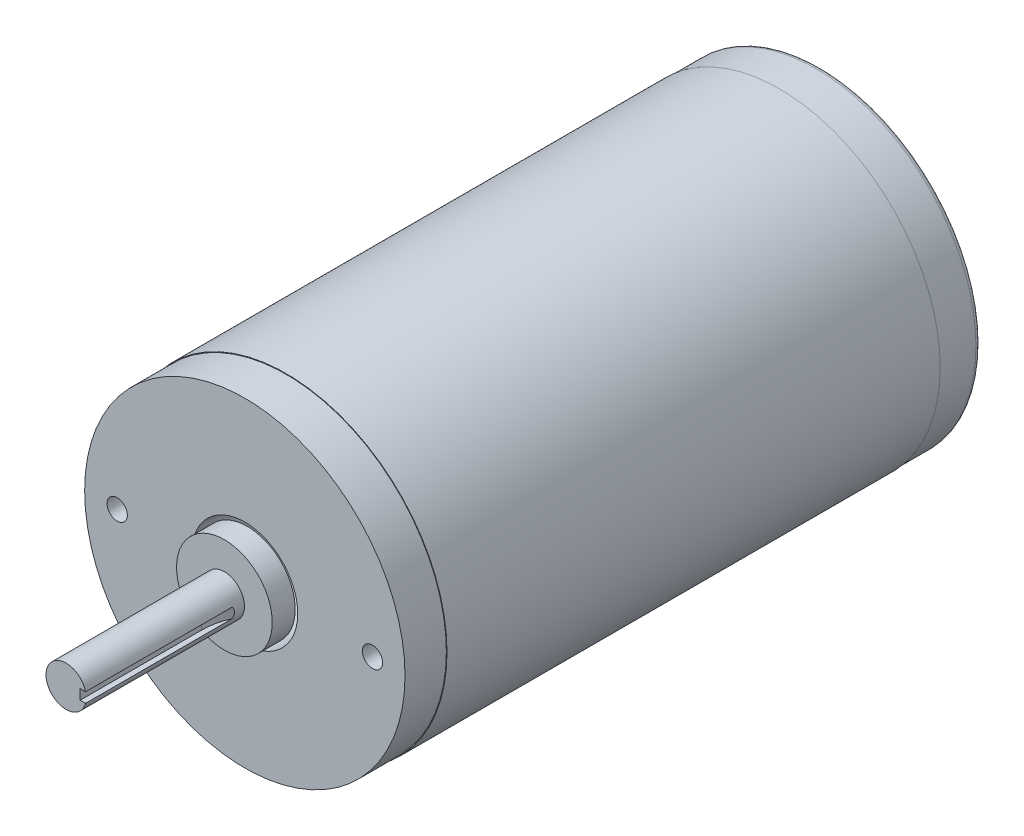
ISO-10303-21;
HEADER;
FILE_DESCRIPTION(('STEP AP214'),'2;1');
FILE_NAME('part.step','',(''),(''),'','','');
FILE_SCHEMA(('AUTOMOTIVE_DESIGN { 1 0 10303 214 1 1 1 1 }'));
ENDSEC;
DATA;
#1=APPLICATION_CONTEXT('core data for automotive mechanical design processes');
#2=APPLICATION_PROTOCOL_DEFINITION('international standard','automotive_design',2000,#1);
#3=PRODUCT_CONTEXT('',#1,'mechanical');
#4=PRODUCT('Part','Part','',(#3));
#5=PRODUCT_RELATED_PRODUCT_CATEGORY('part','',(#4));
#6=PRODUCT_DEFINITION_FORMATION('','',#4);
#7=PRODUCT_DEFINITION_CONTEXT('part definition',#1,'design');
#8=PRODUCT_DEFINITION('design','',#6,#7);
#9=PRODUCT_DEFINITION_SHAPE('','',#8);
#10=(LENGTH_UNIT() NAMED_UNIT(*) SI_UNIT(.MILLI.,.METRE.));
#11=(NAMED_UNIT(*) PLANE_ANGLE_UNIT() SI_UNIT($,.RADIAN.));
#12=(NAMED_UNIT(*) SI_UNIT($,.STERADIAN.) SOLID_ANGLE_UNIT());
#13=UNCERTAINTY_MEASURE_WITH_UNIT(LENGTH_MEASURE(1.E-05),#10,'distance_accuracy_value','');
#14=(GEOMETRIC_REPRESENTATION_CONTEXT(3) GLOBAL_UNCERTAINTY_ASSIGNED_CONTEXT((#13)) GLOBAL_UNIT_ASSIGNED_CONTEXT((#10,
#11,#12)) REPRESENTATION_CONTEXT('',''));
#15=CARTESIAN_POINT('',(0.,0.,0.));
#16=DIRECTION('',(0.,0.,1.));
#17=DIRECTION('',(1.,0.,0.));
#18=AXIS2_PLACEMENT_3D('',#15,#16,#17);
#19=CARTESIAN_POINT('',(35.56,109.2962,18.542));
#20=DIRECTION('',(0.,0.,1.));
#21=DIRECTION('',(1.,0.,0.));
#22=AXIS2_PLACEMENT_3D('',#19,#20,#21);
#23=PLANE('',#22);
#24=CARTESIAN_POINT('',(35.56,109.2962,18.542));
#25=DIRECTION('',(0.,0.,-1.));
#26=DIRECTION('',(-1.,0.,0.));
#27=AXIS2_PLACEMENT_3D('',#24,#25,#26);
#28=CIRCLE('',#27,9.52500000000019);
#29=CARTESIAN_POINT('',(26.0349999999998,109.2962,18.542));
#30=VERTEX_POINT('',#29);
#31=EDGE_CURVE('P0_E19',#30,#30,#28,.F.);
#32=ORIENTED_EDGE('',*,*,#31,.F.);
#33=EDGE_LOOP('',(#32));
#34=FACE_BOUND('',#33,.T.);
#35=ADVANCED_FACE('P0_F16',(#34),#23,.F.);
#36=CARTESIAN_POINT('',(35.56,109.2962,23.114));
#37=DIRECTION('',(0.,0.,-1.));
#38=DIRECTION('',(-1.,0.,0.));
#39=AXIS2_PLACEMENT_3D('',#36,#37,#38);
#40=CYLINDRICAL_SURFACE('',#39,9.52500000000019);
#41=CARTESIAN_POINT('',(35.56,109.2962,23.114));
#42=DIRECTION('',(0.,0.,-1.));
#43=DIRECTION('',(-1.,0.,0.));
#44=AXIS2_PLACEMENT_3D('',#41,#42,#43);
#45=CIRCLE('',#44,9.52500000000019);
#46=CARTESIAN_POINT('',(26.0349999999998,109.2962,23.114));
#47=VERTEX_POINT('',#46);
#48=EDGE_CURVE('P0_E73',#47,#47,#45,.F.);
#49=ORIENTED_EDGE('',*,*,#48,.F.);
#50=EDGE_LOOP('',(#49));
#51=FACE_BOUND('',#50,.T.);
#52=ORIENTED_EDGE('',*,*,#31,.T.);
#53=EDGE_LOOP('',(#52));
#54=FACE_BOUND('',#53,.T.);
#55=ADVANCED_FACE('P0_F126',(#51,#54),#40,.T.);
#56=CARTESIAN_POINT('',(38.36,108.2962,-87.326199999998));
#57=DIRECTION('',(0.,-1.,0.));
#58=DIRECTION('',(1.,0.,0.));
#59=AXIS2_PLACEMENT_3D('',#56,#57,#58);
#60=PLANE('',#59);
#61=DIRECTION('',(1.,0.,0.));
#62=VECTOR('',#61,1.);
#63=CARTESIAN_POINT('',(38.36,108.2962,54.614));
#64=LINE('',#63,#62);
#65=CARTESIAN_POINT('',(39.4329833462075,108.2962,54.614));
#66=VERTEX_POINT('',#65);
#67=CARTESIAN_POINT('',(38.36,108.2962,54.614));
#68=VERTEX_POINT('',#67);
#69=EDGE_CURVE('P0_E64',#66,#68,#64,.F.);
#70=ORIENTED_EDGE('',*,*,#69,.F.);
#71=DIRECTION('',(0.,0.,-1.));
#72=VECTOR('',#71,1.);
#73=CARTESIAN_POINT('',(39.4329833462075,108.2962,54.614));
#74=LINE('',#73,#72);
#75=CARTESIAN_POINT('',(39.4329833462075,108.2962,25.3938184471467));
#76=VERTEX_POINT('',#75);
#77=EDGE_CURVE('P0_E61',#76,#66,#74,.F.);
#78=ORIENTED_EDGE('',*,*,#77,.F.);
#79=CARTESIAN_POINT('',(51.0600000000007,108.2962,30.5028774341242));
#80=DIRECTION('',(0.,1.,0.));
#81=DIRECTION('',(0.,0.,1.));
#82=AXIS2_PLACEMENT_3D('',#79,#80,#81);
#83=CIRCLE('',#82,12.7);
#84=CARTESIAN_POINT('',(38.36,108.2962,30.5028774341242));
#85=VERTEX_POINT('',#84);
#86=EDGE_CURVE('P0_E53',#76,#85,#83,.T.);
#87=ORIENTED_EDGE('',*,*,#86,.T.);
#88=DIRECTION('',(0.,0.,1.));
#89=VECTOR('',#88,1.);
#90=CARTESIAN_POINT('',(38.36,108.2962,-87.326199999998));
#91=LINE('',#90,#89);
#92=EDGE_CURVE('P0_E58',#85,#68,#91,.T.);
#93=ORIENTED_EDGE('',*,*,#92,.T.);
#94=EDGE_LOOP('',(#70,#78,#87,#93));
#95=FACE_BOUND('',#94,.T.);
#96=ADVANCED_FACE('P0_F56',(#95),#60,.F.);
#97=CARTESIAN_POINT('',(51.0600000000007,110.2962,30.5028774341242));
#98=DIRECTION('',(0.,1.,0.));
#99=DIRECTION('',(0.,0.,1.));
#100=AXIS2_PLACEMENT_3D('',#97,#98,#99);
#101=CYLINDRICAL_SURFACE('',#100,12.7);
#102=DIRECTION('',(0.,1.,0.));
#103=VECTOR('',#102,1.);
#104=CARTESIAN_POINT('',(38.36,110.2962,30.5028774341242));
#105=LINE('',#104,#103);
#106=CARTESIAN_POINT('',(38.36,110.2962,30.5028774341242));
#107=VERTEX_POINT('',#106);
#108=EDGE_CURVE('P0_E66',#107,#85,#105,.F.);
#109=ORIENTED_EDGE('',*,*,#108,.T.);
#110=ORIENTED_EDGE('',*,*,#86,.F.);
#111=CARTESIAN_POINT('',(39.4329833462075,110.2962,25.3938184471467));
#112=CARTESIAN_POINT('',(39.4443337341014,110.252233067405,25.3679868799096));
#113=CARTESIAN_POINT('',(39.4551422770259,110.20727992269,25.343623419365));
#114=CARTESIAN_POINT('',(39.4754908545726,110.115440889332,25.2980943853887));
#115=CARTESIAN_POINT('',(39.4850293802644,110.068552786821,25.2769326119428));
#116=CARTESIAN_POINT('',(39.5114158870653,109.925246069415,25.2187466684963));
#117=CARTESIAN_POINT('',(39.5260449336521,109.826146942811,25.1869990834614));
#118=CARTESIAN_POINT('',(39.5445173704809,109.65480942391,25.1471349749067));
#119=CARTESIAN_POINT('',(39.5502970689254,109.583739791249,25.1347469712102));
#120=CARTESIAN_POINT('',(39.5580378376477,109.44052295343,25.1181817732074));
#121=CARTESIAN_POINT('',(39.5600037215014,109.36837722257,25.1139942286931));
#122=CARTESIAN_POINT('',(39.5599946275477,109.192003156294,25.1140083316092));
#123=CARTESIAN_POINT('',(39.5558844928082,109.087740682188,25.1227557563576));
#124=CARTESIAN_POINT('',(39.5398789538826,108.882407215092,25.1571177496053));
#125=CARTESIAN_POINT('',(39.527961125063,108.781346296514,25.1827809034122));
#126=CARTESIAN_POINT('',(39.5022370611798,108.615369663549,25.2389677686343));
#127=CARTESIAN_POINT('',(39.4901145703297,108.548828415953,25.2656236567621));
#128=CARTESIAN_POINT('',(39.4633247699613,108.419617122596,25.3252155966219));
#129=CARTESIAN_POINT('',(39.4486722045253,108.356927353284,25.3581153663461));
#130=CARTESIAN_POINT('',(39.4329833462075,108.2962,25.3938184471467));
#131=B_SPLINE_CURVE_WITH_KNOTS('',3,(#111,#112,#113,#114,#115,#116,#117,#118,#119,#120,#121,
#122,#123,#124,#125,#126,#127,#128,#129,#130),.UNSPECIFIED.,.F.,.F.,(4,2,2,2,2,2,2,2,2,4),(0.,
0.156654458532963,0.313493411076015,0.627036132035703,0.843633608325465,1.05995752950285,
1.37224815252889,1.68543966723697,1.90313772112854,2.11960749579829),.UNSPECIFIED.);
#132=CARTESIAN_POINT('',(39.4329833462075,110.2962,25.3938184471467));
#133=VERTEX_POINT('',#132);
#134=EDGE_CURVE('P0_E93',#133,#76,#131,.T.);
#135=ORIENTED_EDGE('',*,*,#134,.F.);
#136=CARTESIAN_POINT('',(51.0600000000007,110.2962,30.5028774341242));
#137=DIRECTION('',(0.,1.,0.));
#138=DIRECTION('',(0.,0.,1.));
#139=AXIS2_PLACEMENT_3D('',#136,#137,#138);
#140=CIRCLE('',#139,12.7);
#141=EDGE_CURVE('P0_E69',#133,#107,#140,.T.);
#142=ORIENTED_EDGE('',*,*,#141,.T.);
#143=EDGE_LOOP('',(#109,#110,#135,#142));
#144=FACE_BOUND('',#143,.T.);
#145=ADVANCED_FACE('P0_F67',(#144),#101,.F.);
#146=CARTESIAN_POINT('',(38.36,110.2962,-87.326199999998));
#147=DIRECTION('',(-1.,0.,0.));
#148=DIRECTION('',(0.,0.,1.));
#149=AXIS2_PLACEMENT_3D('',#146,#147,#148);
#150=PLANE('',#149);
#151=DIRECTION('',(0.,0.,1.));
#152=VECTOR('',#151,1.);
#153=CARTESIAN_POINT('',(38.36,110.2962,-87.326199999998));
#154=LINE('',#153,#152);
#155=CARTESIAN_POINT('',(38.36,110.2962,54.614));
#156=VERTEX_POINT('',#155);
#157=EDGE_CURVE('P0_E92',#107,#156,#154,.T.);
#158=ORIENTED_EDGE('',*,*,#157,.T.);
#159=DIRECTION('',(0.,1.,0.));
#160=VECTOR('',#159,1.);
#161=CARTESIAN_POINT('',(38.36,109.2962,54.614));
#162=LINE('',#161,#160);
#163=EDGE_CURVE('P0_E76',#68,#156,#162,.T.);
#164=ORIENTED_EDGE('',*,*,#163,.F.);
#165=ORIENTED_EDGE('',*,*,#92,.F.);
#166=ORIENTED_EDGE('',*,*,#108,.F.);
#167=EDGE_LOOP('',(#158,#164,#165,#166));
#168=FACE_BOUND('',#167,.T.);
#169=ADVANCED_FACE('P0_F75',(#168),#150,.F.);
#170=CARTESIAN_POINT('',(35.56,109.2962,23.114));
#171=DIRECTION('',(0.,0.,1.));
#172=DIRECTION('',(1.,0.,0.));
#173=AXIS2_PLACEMENT_3D('',#170,#171,#172);
#174=PLANE('',#173);
#175=CARTESIAN_POINT('',(35.56,109.2962,23.114));
#176=DIRECTION('',(0.,0.,-1.));
#177=DIRECTION('',(-1.,0.,0.));
#178=AXIS2_PLACEMENT_3D('',#175,#176,#177);
#179=CIRCLE('',#178,4.00000000000007);
#180=CARTESIAN_POINT('',(31.5599999999999,109.2962,23.114));
#181=VERTEX_POINT('',#180);
#182=EDGE_CURVE('P0_E88',#181,#181,#179,.F.);
#183=ORIENTED_EDGE('',*,*,#182,.F.);
#184=EDGE_LOOP('',(#183));
#185=FACE_BOUND('',#184,.T.);
#186=ORIENTED_EDGE('',*,*,#48,.T.);
#187=EDGE_LOOP('',(#186));
#188=FACE_BOUND('',#187,.T.);
#189=ADVANCED_FACE('P0_F115',(#185,#188),#174,.T.);
#190=CARTESIAN_POINT('',(35.56,109.2962,54.614));
#191=DIRECTION('',(0.,0.,1.));
#192=DIRECTION('',(1.,0.,0.));
#193=AXIS2_PLACEMENT_3D('',#190,#191,#192);
#194=PLANE('',#193);
#195=ORIENTED_EDGE('',*,*,#69,.T.);
#196=ORIENTED_EDGE('',*,*,#163,.T.);
#197=DIRECTION('',(-1.,0.,0.));
#198=VECTOR('',#197,1.);
#199=CARTESIAN_POINT('',(39.4329833462075,110.2962,54.614));
#200=LINE('',#199,#198);
#201=CARTESIAN_POINT('',(39.4329833462075,110.2962,54.614));
#202=VERTEX_POINT('',#201);
#203=EDGE_CURVE('P0_E33',#156,#202,#200,.F.);
#204=ORIENTED_EDGE('',*,*,#203,.T.);
#205=CARTESIAN_POINT('',(35.56,109.2962,54.614));
#206=DIRECTION('',(0.,0.,-1.));
#207=DIRECTION('',(-1.,0.,0.));
#208=AXIS2_PLACEMENT_3D('',#205,#206,#207);
#209=CIRCLE('',#208,4.00000000000007);
#210=EDGE_CURVE('P0_E25',#66,#202,#209,.T.);
#211=ORIENTED_EDGE('',*,*,#210,.F.);
#212=EDGE_LOOP('',(#195,#196,#204,#211));
#213=FACE_BOUND('',#212,.T.);
#214=ADVANCED_FACE('P0_F111',(#213),#194,.T.);
#215=CARTESIAN_POINT('',(39.4329833462075,110.2962,-87.326199999998));
#216=DIRECTION('',(0.,1.,0.));
#217=DIRECTION('',(-1.,0.,0.));
#218=AXIS2_PLACEMENT_3D('',#215,#216,#217);
#219=PLANE('',#218);
#220=ORIENTED_EDGE('',*,*,#203,.F.);
#221=ORIENTED_EDGE('',*,*,#157,.F.);
#222=ORIENTED_EDGE('',*,*,#141,.F.);
#223=DIRECTION('',(0.,0.,-1.));
#224=VECTOR('',#223,1.);
#225=CARTESIAN_POINT('',(39.4329833462075,110.2962,54.614));
#226=LINE('',#225,#224);
#227=EDGE_CURVE('P0_E11',#202,#133,#226,.T.);
#228=ORIENTED_EDGE('',*,*,#227,.F.);
#229=EDGE_LOOP('',(#220,#221,#222,#228));
#230=FACE_BOUND('',#229,.T.);
#231=ADVANCED_FACE('P0_F107',(#230),#219,.F.);
#232=CARTESIAN_POINT('',(35.56,109.2962,54.614));
#233=DIRECTION('',(0.,0.,-1.));
#234=DIRECTION('',(-1.,0.,0.));
#235=AXIS2_PLACEMENT_3D('',#232,#233,#234);
#236=CYLINDRICAL_SURFACE('',#235,4.00000000000007);
#237=ORIENTED_EDGE('',*,*,#182,.T.);
#238=EDGE_LOOP('',(#237));
#239=FACE_BOUND('',#238,.T.);
#240=ORIENTED_EDGE('',*,*,#210,.T.);
#241=ORIENTED_EDGE('',*,*,#227,.T.);
#242=ORIENTED_EDGE('',*,*,#134,.T.);
#243=ORIENTED_EDGE('',*,*,#77,.T.);
#244=EDGE_LOOP('',(#240,#241,#242,#243));
#245=FACE_BOUND('',#244,.T.);
#246=ADVANCED_FACE('P0_F103',(#239,#245),#236,.T.);
#247=CLOSED_SHELL('',(#35,#55,#96,#145,#169,#189,#214,#231,#246));
#248=MANIFOLD_SOLID_BREP('P0_B1',#247);
#249=CARTESIAN_POINT('',(54.1670906828555,120.503559639096,-97.8026999999982));
#250=DIRECTION('',(0.,0.,-1.));
#251=DIRECTION('',(-1.,0.,0.));
#252=AXIS2_PLACEMENT_3D('',#249,#250,#251);
#253=PLANE('',#252);
#254=CARTESIAN_POINT('',(54.1670906828555,120.503559639096,-97.8026999999884));
#255=DIRECTION('',(0.,0.,1.));
#256=DIRECTION('',(1.,0.,0.));
#257=AXIS2_PLACEMENT_3D('',#254,#255,#256);
#258=CIRCLE('',#257,2.11800000002163);
#259=CARTESIAN_POINT('',(56.2850906828771,120.503559639096,-97.8026999999884));
#260=VERTEX_POINT('',#259);
#261=EDGE_CURVE('P1_E216',#260,#260,#258,.T.);
#262=ORIENTED_EDGE('',*,*,#261,.F.);
#263=EDGE_LOOP('',(#262));
#264=FACE_BOUND('',#263,.T.);
#265=ADVANCED_FACE('P1_F16',(#264),#253,.T.);
#266=CARTESIAN_POINT('',(46.7673596390944,127.903290682857,-97.802699999998));
#267=DIRECTION('',(0.,0.,-1.));
#268=DIRECTION('',(-1.,0.,0.));
#269=AXIS2_PLACEMENT_3D('',#266,#267,#268);
#270=PLANE('',#269);
#271=CARTESIAN_POINT('',(46.7673596390944,127.903290682857,-97.8027000000452));
#272=DIRECTION('',(0.,0.,1.));
#273=DIRECTION('',(1.,0.,0.));
#274=AXIS2_PLACEMENT_3D('',#271,#272,#273);
#275=CIRCLE('',#274,2.11799999993556);
#276=CARTESIAN_POINT('',(48.88535963903,127.903290682857,-97.8027000000452));
#277=VERTEX_POINT('',#276);
#278=EDGE_CURVE('P1_E57',#277,#277,#275,.T.);
#279=ORIENTED_EDGE('',*,*,#278,.F.);
#280=EDGE_LOOP('',(#279));
#281=FACE_BOUND('',#280,.T.);
#282=ADVANCED_FACE('P1_F105',(#281),#270,.T.);
#283=CARTESIAN_POINT('',(35.56,109.2962,-100.317299999998));
#284=DIRECTION('',(0.,0.,-1.));
#285=DIRECTION('',(-1.,0.,0.));
#286=AXIS2_PLACEMENT_3D('',#283,#284,#285);
#287=PLANE('',#286);
#288=CARTESIAN_POINT('',(35.56,109.2962,-100.317299999998));
#289=DIRECTION('',(0.,0.,1.));
#290=DIRECTION('',(1.,0.,0.));
#291=AXIS2_PLACEMENT_3D('',#288,#289,#290);
#292=CIRCLE('',#291,14.0368000000003);
#293=CARTESIAN_POINT('',(49.5968000000003,109.2962,-100.317299999998));
#294=VERTEX_POINT('',#293);
#295=CARTESIAN_POINT('',(21.5231999999997,109.2962,-100.317299999998));
#296=VERTEX_POINT('',#295);
#297=EDGE_CURVE('P1_E55',#294,#296,#292,.T.);
#298=ORIENTED_EDGE('',*,*,#297,.F.);
#299=CARTESIAN_POINT('',(35.56,109.2962,-100.317299999998));
#300=DIRECTION('',(0.,0.,1.));
#301=DIRECTION('',(-1.,0.,0.));
#302=AXIS2_PLACEMENT_3D('',#299,#300,#301);
#303=CIRCLE('',#302,14.0368000000003);
#304=EDGE_CURVE('P1_E50',#296,#294,#303,.T.);
#305=ORIENTED_EDGE('',*,*,#304,.F.);
#306=EDGE_LOOP('',(#298,#305));
#307=FACE_BOUND('',#306,.T.);
#308=ADVANCED_FACE('P1_F54',(#307),#287,.T.);
#309=CARTESIAN_POINT('',(54.1670906828555,120.503559639096,-95.6026999980963));
#310=DIRECTION('',(0.,0.,1.));
#311=DIRECTION('',(1.,0.,0.));
#312=AXIS2_PLACEMENT_3D('',#309,#310,#311);
#313=CONICAL_SURFACE('',#312,4.31800000191365,0.785398163397448);
#314=ORIENTED_EDGE('',*,*,#261,.T.);
#315=EDGE_LOOP('',(#314));
#316=FACE_BOUND('',#315,.T.);
#317=CARTESIAN_POINT('',(54.1670906828555,120.503559639096,-95.6026999980706));
#318=DIRECTION('',(0.,0.,-1.));
#319=DIRECTION('',(-1.,0.,0.));
#320=AXIS2_PLACEMENT_3D('',#317,#318,#319);
#321=CIRCLE('',#320,4.31800000195455);
#322=CARTESIAN_POINT('',(49.8490906809009,120.503559639096,-95.6026999980706));
#323=VERTEX_POINT('',#322);
#324=EDGE_CURVE('P1_E63',#323,#323,#321,.F.);
#325=ORIENTED_EDGE('',*,*,#324,.F.);
#326=EDGE_LOOP('',(#325));
#327=FACE_BOUND('',#326,.T.);
#328=ADVANCED_FACE('P1_F104',(#316,#327),#313,.T.);
#329=CARTESIAN_POINT('',(46.7673596390944,127.903290682857,-95.6026999980963));
#330=DIRECTION('',(0.,0.,1.));
#331=DIRECTION('',(1.,0.,0.));
#332=AXIS2_PLACEMENT_3D('',#329,#330,#331);
#333=CONICAL_SURFACE('',#332,4.31800000188443,0.785398163397448);
#334=ORIENTED_EDGE('',*,*,#278,.T.);
#335=EDGE_LOOP('',(#334));
#336=FACE_BOUND('',#335,.T.);
#337=CARTESIAN_POINT('',(46.7673596390944,127.903290682857,-95.6026999980564));
#338=DIRECTION('',(0.,0.,-1.));
#339=DIRECTION('',(-1.,0.,0.));
#340=AXIS2_PLACEMENT_3D('',#337,#338,#339);
#341=CIRCLE('',#340,4.31800000194089);
#342=CARTESIAN_POINT('',(42.4493596371535,127.903290682857,-95.6026999980564));
#343=VERTEX_POINT('',#342);
#344=EDGE_CURVE('P1_E91',#343,#343,#341,.F.);
#345=ORIENTED_EDGE('',*,*,#344,.F.);
#346=EDGE_LOOP('',(#345));
#347=FACE_BOUND('',#346,.T.);
#348=ADVANCED_FACE('P1_F82',(#336,#347),#333,.T.);
#349=CARTESIAN_POINT('',(35.56,109.2962,-99.317299999998));
#350=DIRECTION('',(0.,0.,-1.));
#351=DIRECTION('',(-1.,0.,0.));
#352=AXIS2_PLACEMENT_3D('',#349,#350,#351);
#353=TOROIDAL_SURFACE('',#352,14.0368000000003,0.999999999999999);
#354=ORIENTED_EDGE('',*,*,#304,.T.);
#355=ORIENTED_EDGE('',*,*,#297,.T.);
#356=EDGE_LOOP('',(#354,#355));
#357=FACE_BOUND('',#356,.T.);
#358=CARTESIAN_POINT('',(35.56,109.2962,-99.317299999998));
#359=DIRECTION('',(0.,0.,1.));
#360=DIRECTION('',(1.,0.,0.));
#361=AXIS2_PLACEMENT_3D('',#358,#359,#360);
#362=CIRCLE('',#361,15.0368000000003);
#363=CARTESIAN_POINT('',(50.5968000000003,109.2962,-99.317299999998));
#364=VERTEX_POINT('',#363);
#365=EDGE_CURVE('P1_E89',#364,#364,#362,.T.);
#366=ORIENTED_EDGE('',*,*,#365,.F.);
#367=EDGE_LOOP('',(#366));
#368=FACE_BOUND('',#367,.T.);
#369=ADVANCED_FACE('P1_F61',(#357,#368),#353,.T.);
#370=CARTESIAN_POINT('',(54.1670906828555,120.503559639096,-95.554799999998));
#371=DIRECTION('',(0.,0.,-1.));
#372=DIRECTION('',(-1.,0.,0.));
#373=AXIS2_PLACEMENT_3D('',#370,#371,#372);
#374=CYLINDRICAL_SURFACE('',#373,4.31800000195455);
#375=CARTESIAN_POINT('',(54.1670906828555,120.503559639096,-95.554799999998));
#376=DIRECTION('',(0.,0.,-1.));
#377=DIRECTION('',(-1.,0.,0.));
#378=AXIS2_PLACEMENT_3D('',#375,#376,#377);
#379=CIRCLE('',#378,4.31800000195455);
#380=CARTESIAN_POINT('',(49.8490906809009,120.503559639096,-95.554799999998));
#381=VERTEX_POINT('',#380);
#382=EDGE_CURVE('P1_E207',#381,#381,#379,.F.);
#383=ORIENTED_EDGE('',*,*,#382,.F.);
#384=EDGE_LOOP('',(#383));
#385=FACE_BOUND('',#384,.T.);
#386=ORIENTED_EDGE('',*,*,#324,.T.);
#387=EDGE_LOOP('',(#386));
#388=FACE_BOUND('',#387,.T.);
#389=ADVANCED_FACE('P1_F81',(#385,#388),#374,.T.);
#390=CARTESIAN_POINT('',(46.7673596390944,127.903290682857,-95.554799999998));
#391=DIRECTION('',(0.,0.,-1.));
#392=DIRECTION('',(-1.,0.,0.));
#393=AXIS2_PLACEMENT_3D('',#390,#391,#392);
#394=CYLINDRICAL_SURFACE('',#393,4.31800000194089);
#395=CARTESIAN_POINT('',(46.7673596390944,127.903290682857,-95.554799999998));
#396=DIRECTION('',(0.,0.,-1.));
#397=DIRECTION('',(-1.,0.,0.));
#398=AXIS2_PLACEMENT_3D('',#395,#396,#397);
#399=CIRCLE('',#398,4.31800000194089);
#400=CARTESIAN_POINT('',(42.4493596371535,127.903290682857,-95.554799999998));
#401=VERTEX_POINT('',#400);
#402=EDGE_CURVE('P1_E203',#401,#401,#399,.F.);
#403=ORIENTED_EDGE('',*,*,#402,.F.);
#404=EDGE_LOOP('',(#403));
#405=FACE_BOUND('',#404,.T.);
#406=ORIENTED_EDGE('',*,*,#344,.T.);
#407=EDGE_LOOP('',(#406));
#408=FACE_BOUND('',#407,.T.);
#409=ADVANCED_FACE('P1_F362',(#405,#408),#394,.T.);
#410=CARTESIAN_POINT('',(35.56,109.2962,-100.317299999998));
#411=DIRECTION('',(0.,0.,1.));
#412=DIRECTION('',(1.,0.,0.));
#413=AXIS2_PLACEMENT_3D('',#410,#411,#412);
#414=CYLINDRICAL_SURFACE('',#413,15.0368000000003);
#415=CARTESIAN_POINT('',(35.56,109.2962,-95.554799999998));
#416=DIRECTION('',(0.,0.,1.));
#417=DIRECTION('',(1.,0.,0.));
#418=AXIS2_PLACEMENT_3D('',#415,#416,#417);
#419=CIRCLE('',#418,15.0368000000003);
#420=CARTESIAN_POINT('',(50.5968000000003,109.2962,-95.554799999998));
#421=VERTEX_POINT('',#420);
#422=EDGE_CURVE('P1_E199',#421,#421,#419,.T.);
#423=ORIENTED_EDGE('',*,*,#422,.F.);
#424=EDGE_LOOP('',(#423));
#425=FACE_BOUND('',#424,.T.);
#426=ORIENTED_EDGE('',*,*,#365,.T.);
#427=EDGE_LOOP('',(#426));
#428=FACE_BOUND('',#427,.T.);
#429=ADVANCED_FACE('P1_F353',(#425,#428),#414,.T.);
#430=CARTESIAN_POINT('',(60.96,109.2962,5.43559999999843));
#431=DIRECTION('',(0.,0.,1.));
#432=DIRECTION('',(1.,0.,0.));
#433=AXIS2_PLACEMENT_3D('',#430,#431,#432);
#434=CONICAL_SURFACE('',#433,2.01930000005181,1.0297442573607);
#435=CARTESIAN_POINT('',(60.9599999998807,109.2962,4.22228214836196));
#436=VERTEX_POINT('',#435);
#437=VERTEX_LOOP('',#436);
#438=FACE_BOUND('',#437,.T.);
#439=CARTESIAN_POINT('',(60.96,109.2962,5.43560000000074));
#440=DIRECTION('',(0.,0.,1.));
#441=DIRECTION('',(1.,0.,0.));
#442=AXIS2_PLACEMENT_3D('',#439,#440,#441);
#443=CIRCLE('',#442,2.01930000000004);
#444=CARTESIAN_POINT('',(62.9793,109.2962,5.43560000000074));
#445=VERTEX_POINT('',#444);
#446=EDGE_CURVE('P1_E197',#445,#445,#443,.T.);
#447=ORIENTED_EDGE('',*,*,#446,.T.);
#448=EDGE_LOOP('',(#447));
#449=FACE_BOUND('',#448,.T.);
#450=ADVANCED_FACE('P1_F345',(#438,#449),#434,.F.);
#451=CARTESIAN_POINT('',(10.1599999999994,109.2962,5.43559999994159));
#452=DIRECTION('',(0.,0.,1.));
#453=DIRECTION('',(1.,0.,0.));
#454=AXIS2_PLACEMENT_3D('',#451,#452,#453);
#455=CONICAL_SURFACE('',#454,2.01929999984395,1.02974425732522);
#456=CARTESIAN_POINT('',(10.1600000001131,109.2962,4.22228214870302));
#457=VERTEX_POINT('',#456);
#458=VERTEX_LOOP('',#457);
#459=FACE_BOUND('',#458,.T.);
#460=CARTESIAN_POINT('',(10.1599999999994,109.2962,5.4356000000007));
#461=DIRECTION('',(0.,0.,1.));
#462=DIRECTION('',(1.,0.,0.));
#463=AXIS2_PLACEMENT_3D('',#460,#461,#462);
#464=CIRCLE('',#463,2.01930000000004);
#465=CARTESIAN_POINT('',(12.1792999999994,109.2962,5.4356000000007));
#466=VERTEX_POINT('',#465);
#467=EDGE_CURVE('P1_E189',#466,#466,#464,.T.);
#468=ORIENTED_EDGE('',*,*,#467,.T.);
#469=EDGE_LOOP('',(#468));
#470=FACE_BOUND('',#469,.T.);
#471=ADVANCED_FACE('P1_F338',(#459,#470),#455,.F.);
#472=CARTESIAN_POINT('',(35.56,109.2962,-87.325199999998));
#473=DIRECTION('',(0.,0.,-1.));
#474=DIRECTION('',(-1.,0.,0.));
#475=AXIS2_PLACEMENT_3D('',#472,#473,#474);
#476=PLANE('',#475);
#477=CARTESIAN_POINT('',(35.56,109.2962,-87.325199999998));
#478=DIRECTION('',(0.,0.,1.));
#479=DIRECTION('',(1.,0.,0.));
#480=AXIS2_PLACEMENT_3D('',#477,#478,#479);
#481=CIRCLE('',#480,10.5283000000002);
#482=CARTESIAN_POINT('',(46.0883000000002,109.2962,-87.325199999998));
#483=VERTEX_POINT('',#482);
#484=EDGE_CURVE('P1_E196',#483,#483,#481,.T.);
#485=ORIENTED_EDGE('',*,*,#484,.T.);
#486=EDGE_LOOP('',(#485));
#487=FACE_BOUND('',#486,.T.);
#488=ADVANCED_FACE('P1_F174',(#487),#476,.F.);
#489=CARTESIAN_POINT('',(35.56,109.2962,-95.554799999998));
#490=DIRECTION('',(0.,0.,-1.));
#491=DIRECTION('',(-1.,0.,0.));
#492=AXIS2_PLACEMENT_3D('',#489,#490,#491);
#493=PLANE('',#492);
#494=ORIENTED_EDGE('',*,*,#422,.T.);
#495=EDGE_LOOP('',(#494));
#496=FACE_BOUND('',#495,.T.);
#497=ORIENTED_EDGE('',*,*,#402,.T.);
#498=EDGE_LOOP('',(#497));
#499=FACE_BOUND('',#498,.T.);
#500=ORIENTED_EDGE('',*,*,#382,.T.);
#501=EDGE_LOOP('',(#500));
#502=FACE_BOUND('',#501,.T.);
#503=CARTESIAN_POINT('',(35.56,109.2962,-95.554799999998));
#504=DIRECTION('',(0.,0.,1.));
#505=DIRECTION('',(1.,0.,0.));
#506=AXIS2_PLACEMENT_3D('',#503,#504,#505);
#507=CIRCLE('',#506,30.8770000000005);
#508=CARTESIAN_POINT('',(66.4370000000005,109.2962,-95.554799999998));
#509=VERTEX_POINT('',#508);
#510=CARTESIAN_POINT('',(4.6829999999995,109.2962,-95.554799999998));
#511=VERTEX_POINT('',#510);
#512=EDGE_CURVE('P1_E158',#509,#511,#507,.T.);
#513=ORIENTED_EDGE('',*,*,#512,.F.);
#514=CARTESIAN_POINT('',(35.56,109.2962,-95.554799999998));
#515=DIRECTION('',(0.,0.,1.));
#516=DIRECTION('',(-1.,0.,0.));
#517=AXIS2_PLACEMENT_3D('',#514,#515,#516);
#518=CIRCLE('',#517,30.8770000000005);
#519=EDGE_CURVE('P1_E35',#511,#509,#518,.T.);
#520=ORIENTED_EDGE('',*,*,#519,.F.);
#521=EDGE_LOOP('',(#513,#520));
#522=FACE_BOUND('',#521,.T.);
#523=ADVANCED_FACE('P1_F163',(#496,#499,#502,#522),#493,.T.);
#524=CARTESIAN_POINT('',(60.96,109.2962,19.05));
#525=DIRECTION('',(0.,0.,1.));
#526=DIRECTION('',(1.,0.,0.));
#527=AXIS2_PLACEMENT_3D('',#524,#525,#526);
#528=CYLINDRICAL_SURFACE('',#527,2.01930000000004);
#529=CARTESIAN_POINT('',(60.96,109.2962,19.05));
#530=DIRECTION('',(0.,0.,1.));
#531=DIRECTION('',(1.,0.,0.));
#532=AXIS2_PLACEMENT_3D('',#529,#530,#531);
#533=CIRCLE('',#532,2.01930000000004);
#534=CARTESIAN_POINT('',(62.9793,109.2962,19.05));
#535=VERTEX_POINT('',#534);
#536=EDGE_CURVE('P1_E228',#535,#535,#533,.F.);
#537=ORIENTED_EDGE('',*,*,#536,.F.);
#538=EDGE_LOOP('',(#537));
#539=FACE_BOUND('',#538,.T.);
#540=ORIENTED_EDGE('',*,*,#446,.F.);
#541=EDGE_LOOP('',(#540));
#542=FACE_BOUND('',#541,.T.);
#543=ADVANCED_FACE('P1_F173',(#539,#542),#528,.F.);
#544=CARTESIAN_POINT('',(10.1599999999994,109.2962,19.05));
#545=DIRECTION('',(0.,0.,1.));
#546=DIRECTION('',(1.,0.,0.));
#547=AXIS2_PLACEMENT_3D('',#544,#545,#546);
#548=CYLINDRICAL_SURFACE('',#547,2.01930000000004);
#549=CARTESIAN_POINT('',(10.1599999999994,109.2962,19.05));
#550=DIRECTION('',(0.,0.,1.));
#551=DIRECTION('',(1.,0.,0.));
#552=AXIS2_PLACEMENT_3D('',#549,#550,#551);
#553=CIRCLE('',#552,2.01930000000004);
#554=CARTESIAN_POINT('',(12.1792999999994,109.2962,19.05));
#555=VERTEX_POINT('',#554);
#556=EDGE_CURVE('P1_E244',#555,#555,#553,.F.);
#557=ORIENTED_EDGE('',*,*,#556,.F.);
#558=EDGE_LOOP('',(#557));
#559=FACE_BOUND('',#558,.T.);
#560=ORIENTED_EDGE('',*,*,#467,.F.);
#561=EDGE_LOOP('',(#560));
#562=FACE_BOUND('',#561,.T.);
#563=ADVANCED_FACE('P1_F234',(#559,#562),#548,.F.);
#564=CARTESIAN_POINT('',(35.56,109.2962,19.05));
#565=DIRECTION('',(0.,0.,1.));
#566=DIRECTION('',(1.,0.,0.));
#567=AXIS2_PLACEMENT_3D('',#564,#565,#566);
#568=CYLINDRICAL_SURFACE('',#567,10.5283000000002);
#569=CARTESIAN_POINT('',(35.56,109.2962,19.05));
#570=DIRECTION('',(0.,0.,1.));
#571=DIRECTION('',(1.,0.,0.));
#572=AXIS2_PLACEMENT_3D('',#569,#570,#571);
#573=CIRCLE('',#572,10.5283000000002);
#574=CARTESIAN_POINT('',(46.0883000000002,109.2962,19.05));
#575=VERTEX_POINT('',#574);
#576=EDGE_CURVE('P1_E242',#575,#575,#573,.F.);
#577=ORIENTED_EDGE('',*,*,#576,.F.);
#578=EDGE_LOOP('',(#577));
#579=FACE_BOUND('',#578,.T.);
#580=ORIENTED_EDGE('',*,*,#484,.F.);
#581=EDGE_LOOP('',(#580));
#582=FACE_BOUND('',#581,.T.);
#583=ADVANCED_FACE('P1_F148',(#579,#582),#568,.F.);
#584=CARTESIAN_POINT('',(35.56,109.2962,-94.554799999998));
#585=DIRECTION('',(0.,0.,-1.));
#586=DIRECTION('',(-1.,0.,0.));
#587=AXIS2_PLACEMENT_3D('',#584,#585,#586);
#588=TOROIDAL_SURFACE('',#587,30.8770000000005,0.999999999999999);
#589=ORIENTED_EDGE('',*,*,#519,.T.);
#590=ORIENTED_EDGE('',*,*,#512,.T.);
#591=EDGE_LOOP('',(#589,#590));
#592=FACE_BOUND('',#591,.T.);
#593=CARTESIAN_POINT('',(35.56,109.2962,-94.554799999998));
#594=DIRECTION('',(0.,0.,1.));
#595=DIRECTION('',(1.,0.,0.));
#596=AXIS2_PLACEMENT_3D('',#593,#594,#595);
#597=CIRCLE('',#596,31.8770000000005);
#598=CARTESIAN_POINT('',(67.4370000000005,109.2962,-94.554799999998));
#599=VERTEX_POINT('',#598);
#600=EDGE_CURVE('P1_E156',#599,#599,#597,.T.);
#601=ORIENTED_EDGE('',*,*,#600,.F.);
#602=EDGE_LOOP('',(#601));
#603=FACE_BOUND('',#602,.T.);
#604=ADVANCED_FACE('P1_F142',(#592,#603),#588,.T.);
#605=CARTESIAN_POINT('',(35.56,109.2962,19.05));
#606=DIRECTION('',(0.,0.,1.));
#607=DIRECTION('',(1.,0.,0.));
#608=AXIS2_PLACEMENT_3D('',#605,#606,#607);
#609=PLANE('',#608);
#610=CARTESIAN_POINT('',(35.56,109.2962,19.05));
#611=DIRECTION('',(0.,0.,-1.));
#612=DIRECTION('',(-1.,0.,0.));
#613=AXIS2_PLACEMENT_3D('',#610,#611,#612);
#614=CIRCLE('',#613,31.8770000000005);
#615=CARTESIAN_POINT('',(3.6829999999995,109.2962,19.05));
#616=VERTEX_POINT('',#615);
#617=EDGE_CURVE('P1_E247',#616,#616,#614,.T.);
#618=ORIENTED_EDGE('',*,*,#617,.F.);
#619=EDGE_LOOP('',(#618));
#620=FACE_BOUND('',#619,.T.);
#621=ORIENTED_EDGE('',*,*,#576,.T.);
#622=EDGE_LOOP('',(#621));
#623=FACE_BOUND('',#622,.T.);
#624=ORIENTED_EDGE('',*,*,#556,.T.);
#625=EDGE_LOOP('',(#624));
#626=FACE_BOUND('',#625,.T.);
#627=ORIENTED_EDGE('',*,*,#536,.T.);
#628=EDGE_LOOP('',(#627));
#629=FACE_BOUND('',#628,.T.);
#630=ADVANCED_FACE('P1_F138',(#620,#623,#626,#629),#609,.T.);
#631=CARTESIAN_POINT('',(35.56,109.2962,-95.554799999998));
#632=DIRECTION('',(0.,0.,1.));
#633=DIRECTION('',(1.,0.,0.));
#634=AXIS2_PLACEMENT_3D('',#631,#632,#633);
#635=CYLINDRICAL_SURFACE('',#634,31.8770000000005);
#636=CARTESIAN_POINT('',(35.56,109.2962,-87.325199999998));
#637=DIRECTION('',(0.,0.,1.));
#638=DIRECTION('',(1.,0.,0.));
#639=AXIS2_PLACEMENT_3D('',#636,#637,#638);
#640=CIRCLE('',#639,31.8770000000005);
#641=CARTESIAN_POINT('',(67.4370000000005,109.2962,-87.325199999998));
#642=VERTEX_POINT('',#641);
#643=EDGE_CURVE('P1_E441',#642,#642,#640,.T.);
#644=ORIENTED_EDGE('',*,*,#643,.F.);
#645=EDGE_LOOP('',(#644));
#646=FACE_BOUND('',#645,.T.);
#647=ORIENTED_EDGE('',*,*,#600,.T.);
#648=EDGE_LOOP('',(#647));
#649=FACE_BOUND('',#648,.T.);
#650=ADVANCED_FACE('P1_F134',(#646,#649),#635,.T.);
#651=CARTESIAN_POINT('',(35.56,109.2962,19.05));
#652=DIRECTION('',(0.,0.,-1.));
#653=DIRECTION('',(-1.,0.,0.));
#654=AXIS2_PLACEMENT_3D('',#651,#652,#653);
#655=CYLINDRICAL_SURFACE('',#654,31.8770000000005);
#656=CARTESIAN_POINT('',(35.56,109.2962,10.8204000000007));
#657=DIRECTION('',(0.,0.,-1.));
#658=DIRECTION('',(-1.,0.,0.));
#659=AXIS2_PLACEMENT_3D('',#656,#657,#658);
#660=CIRCLE('',#659,31.8770000000005);
#661=CARTESIAN_POINT('',(3.6829999999995,109.2962,10.8204000000007));
#662=VERTEX_POINT('',#661);
#663=EDGE_CURVE('P1_E444',#662,#662,#660,.T.);
#664=ORIENTED_EDGE('',*,*,#663,.F.);
#665=EDGE_LOOP('',(#664));
#666=FACE_BOUND('',#665,.T.);
#667=ORIENTED_EDGE('',*,*,#617,.T.);
#668=EDGE_LOOP('',(#667));
#669=FACE_BOUND('',#668,.T.);
#670=ADVANCED_FACE('P1_F130',(#666,#669),#655,.T.);
#671=CARTESIAN_POINT('',(67.5640000000005,109.2962,-87.325199999998));
#672=DIRECTION('',(0.,0.,-1.));
#673=DIRECTION('',(-1.,0.,0.));
#674=AXIS2_PLACEMENT_3D('',#671,#672,#673);
#675=PLANE('',#674);
#676=ORIENTED_EDGE('',*,*,#643,.T.);
#677=EDGE_LOOP('',(#676));
#678=FACE_BOUND('',#677,.T.);
#679=CARTESIAN_POINT('',(35.56,109.2962,-87.325199999998));
#680=DIRECTION('',(0.,0.,1.));
#681=DIRECTION('',(1.,0.,0.));
#682=AXIS2_PLACEMENT_3D('',#679,#680,#681);
#683=CIRCLE('',#682,32.0040000000005);
#684=CARTESIAN_POINT('',(67.5640000000005,109.2962,-87.325199999998));
#685=VERTEX_POINT('',#684);
#686=EDGE_CURVE('P1_E27',#685,#685,#683,.T.);
#687=ORIENTED_EDGE('',*,*,#686,.F.);
#688=EDGE_LOOP('',(#687));
#689=FACE_BOUND('',#688,.T.);
#690=ADVANCED_FACE('P1_F123',(#678,#689),#675,.T.);
#691=CARTESIAN_POINT('',(35.56,109.2962,10.8204000000007));
#692=DIRECTION('',(0.,0.,1.));
#693=DIRECTION('',(1.,0.,0.));
#694=AXIS2_PLACEMENT_3D('',#691,#692,#693);
#695=PLANE('',#694);
#696=ORIENTED_EDGE('',*,*,#663,.T.);
#697=EDGE_LOOP('',(#696));
#698=FACE_BOUND('',#697,.T.);
#699=CARTESIAN_POINT('',(35.56,109.2962,10.8204000000007));
#700=DIRECTION('',(0.,0.,1.));
#701=DIRECTION('',(1.,0.,0.));
#702=AXIS2_PLACEMENT_3D('',#699,#700,#701);
#703=CIRCLE('',#702,32.0040000000005);
#704=CARTESIAN_POINT('',(67.5640000000005,109.2962,10.8204000000007));
#705=VERTEX_POINT('',#704);
#706=EDGE_CURVE('P1_E11',#705,#705,#703,.F.);
#707=ORIENTED_EDGE('',*,*,#706,.F.);
#708=EDGE_LOOP('',(#707));
#709=FACE_BOUND('',#708,.T.);
#710=ADVANCED_FACE('P1_F117',(#698,#709),#695,.T.);
#711=CARTESIAN_POINT('',(35.56,109.2962,-87.325199999998));
#712=DIRECTION('',(0.,0.,1.));
#713=DIRECTION('',(1.,0.,0.));
#714=AXIS2_PLACEMENT_3D('',#711,#712,#713);
#715=CYLINDRICAL_SURFACE('',#714,32.0040000000005);
#716=ORIENTED_EDGE('',*,*,#706,.T.);
#717=EDGE_LOOP('',(#716));
#718=FACE_BOUND('',#717,.T.);
#719=ORIENTED_EDGE('',*,*,#686,.T.);
#720=EDGE_LOOP('',(#719));
#721=FACE_BOUND('',#720,.T.);
#722=ADVANCED_FACE('P1_F115',(#718,#721),#715,.T.);
#723=CLOSED_SHELL('',(#265,#282,#308,#328,#348,#369,#389,#409,#429,#450,#471,#488,#523,#543,
#563,#583,#604,#630,#650,#670,#690,#710,#722));
#724=MANIFOLD_SOLID_BREP('P1_B1',#723);
#725=CARTESIAN_POINT('',(51.0600000000007,110.2962,30.5028774341242));
#726=DIRECTION('',(0.,1.,0.));
#727=DIRECTION('',(0.,0.,1.));
#728=AXIS2_PLACEMENT_3D('',#725,#726,#727);
#729=CYLINDRICAL_SURFACE('',#728,12.7);
#730=CARTESIAN_POINT('',(51.0600000000007,108.2962,30.5028774341242));
#731=DIRECTION('',(0.,1.,0.));
#732=DIRECTION('',(0.,0.,1.));
#733=AXIS2_PLACEMENT_3D('',#730,#731,#732);
#734=CIRCLE('',#733,12.7);
#735=CARTESIAN_POINT('',(39.4329833462075,108.2962,25.3938184471467));
#736=VERTEX_POINT('',#735);
#737=CARTESIAN_POINT('',(38.3600000000007,108.2962,30.5028774341239));
#738=VERTEX_POINT('',#737);
#739=EDGE_CURVE('P2_E24',#736,#738,#734,.T.);
#740=ORIENTED_EDGE('',*,*,#739,.T.);
#741=DIRECTION('',(0.,1.,0.));
#742=VECTOR('',#741,1.);
#743=CARTESIAN_POINT('',(38.3600000000007,110.2962,30.5028774341239));
#744=LINE('',#743,#742);
#745=CARTESIAN_POINT('',(38.3600000000007,110.2962,30.5028774341239));
#746=VERTEX_POINT('',#745);
#747=EDGE_CURVE('P2_E11',#738,#746,#744,.T.);
#748=ORIENTED_EDGE('',*,*,#747,.T.);
#749=CARTESIAN_POINT('',(51.0600000000007,110.2962,30.5028774341242));
#750=DIRECTION('',(0.,1.,0.));
#751=DIRECTION('',(0.,0.,1.));
#752=AXIS2_PLACEMENT_3D('',#749,#750,#751);
#753=CIRCLE('',#752,12.7);
#754=CARTESIAN_POINT('',(39.4329833462075,110.2962,25.3938184471467));
#755=VERTEX_POINT('',#754);
#756=EDGE_CURVE('P2_E18',#746,#755,#753,.F.);
#757=ORIENTED_EDGE('',*,*,#756,.T.);
#758=CARTESIAN_POINT('',(39.4329833462075,110.2962,25.3938184471467));
#759=CARTESIAN_POINT('',(39.4397709318088,110.269910321047,25.3783713191111));
#760=CARTESIAN_POINT('',(39.446373941815,110.243273041973,25.3634281967937));
#761=CARTESIAN_POINT('',(39.4590506321686,110.189789029698,25.3348784964682));
#762=CARTESIAN_POINT('',(39.4651315175866,110.162953982436,25.3212532034994));
#763=CARTESIAN_POINT('',(39.476750430804,110.109074046365,25.2953321295195));
#764=CARTESIAN_POINT('',(39.4822955176516,110.082039171942,25.283018743817));
#765=CARTESIAN_POINT('',(39.4928306024655,110.027761890437,25.2597149012501));
#766=CARTESIAN_POINT('',(39.4978273017719,110.000527728566,25.2487082953785));
#767=CARTESIAN_POINT('',(39.5072549897854,109.94585354782,25.2280115102491));
#768=CARTESIAN_POINT('',(39.5116920984444,109.918420019661,25.2183069985491));
#769=CARTESIAN_POINT('',(39.5199915106346,109.863348940776,25.2002080857897));
#770=CARTESIAN_POINT('',(39.5238591325565,109.835716195416,25.1918015218147));
#771=CARTESIAN_POINT('',(39.5310120035742,109.780248380618,25.1762923959738));
#772=CARTESIAN_POINT('',(39.534301562309,109.752416573443,25.1691801688716));
#773=CARTESIAN_POINT('',(39.5402922684092,109.696552186228,25.1562538009222));
#774=CARTESIAN_POINT('',(39.5429965339125,109.668521535299,25.1504327768663));
#775=CARTESIAN_POINT('',(39.5478119955773,109.612260770868,25.1400833999365));
#776=CARTESIAN_POINT('',(39.5499249716829,109.584031524066,25.1355511667659));
#777=CARTESIAN_POINT('',(39.5535549625999,109.527374616015,25.1277736195891));
#778=CARTESIAN_POINT('',(39.5550723163452,109.498947077005,25.1245275736789));
#779=CARTESIAN_POINT('',(39.5575082849785,109.441894198299,25.1193198143198));
#780=CARTESIAN_POINT('',(39.558425745684,109.413268583767,25.1173605766324));
#781=CARTESIAN_POINT('',(39.5596651888575,109.355820183211,25.1147143565083));
#782=CARTESIAN_POINT('',(39.559984542948,109.326997082971,25.1140329896525));
#783=CARTESIAN_POINT('',(39.5600147086912,109.26891601778,25.1139686073153));
#784=CARTESIAN_POINT('',(39.5597163211225,109.239658014521,25.1146052187696));
#785=CARTESIAN_POINT('',(39.5584762309811,109.181238227459,25.1172527625643));
#786=CARTESIAN_POINT('',(39.5575349796822,109.15207639057,25.1192627308442));
#787=CARTESIAN_POINT('',(39.5550168098411,109.093848886421,25.1246462528829));
#788=CARTESIAN_POINT('',(39.5534386470206,109.064783520343,25.1280224758089));
#789=CARTESIAN_POINT('',(39.5496509699881,109.006748509995,25.1361386363236));
#790=CARTESIAN_POINT('',(39.547438582855,108.977779922302,25.1408847800926));
#791=CARTESIAN_POINT('',(39.5423892628375,108.919937747339,25.1517393345308));
#792=CARTESIAN_POINT('',(39.5395479607329,108.89106633474,25.1578572794956));
#793=CARTESIAN_POINT('',(39.5332492093153,108.833416904545,25.1714542802647));
#794=CARTESIAN_POINT('',(39.5297860786654,108.80464247691,25.178945901304));
#795=CARTESIAN_POINT('',(39.522427109718,108.748529440388,25.1949130066396));
#796=CARTESIAN_POINT('',(39.5185506711544,108.721175837349,25.2033448502673));
#797=CARTESIAN_POINT('',(39.5102678044819,108.666740433015,25.2214206591048));
#798=CARTESIAN_POINT('',(39.5058579130797,108.639661797101,25.2310725656391));
#799=CARTESIAN_POINT('',(39.4965187005788,108.58577490266,25.2515891747876));
#800=CARTESIAN_POINT('',(39.4915850845973,108.558971231757,25.2624639569676));
#801=CARTESIAN_POINT('',(39.4812093417873,108.505632740376,25.2854290767111));
#802=CARTESIAN_POINT('',(39.4757622546212,108.479104042856,25.2975313809032));
#803=CARTESIAN_POINT('',(39.4643716350422,108.426314427986,25.3229547312977));
#804=CARTESIAN_POINT('',(39.4584226600691,108.400061233113,25.3362893449441));
#805=CARTESIAN_POINT('',(39.4460413465813,108.347819193283,25.3641810247647));
#806=CARTESIAN_POINT('',(39.4396032679488,108.32183964228,25.3787529648295));
#807=CARTESIAN_POINT('',(39.4329833462075,108.2962,25.3938184471467));
#808=B_SPLINE_CURVE_WITH_KNOTS('',3,(#758,#759,#760,#761,#762,#763,#764,#765,#766,#767,#768,
#769,#770,#771,#772,#773,#774,#775,#776,#777,#778,#779,#780,#781,#782,#783,#784,#785,#786,#787,
#788,#789,#790,#791,#792,#793,#794,#795,#796,#797,#798,#799,#800,#801,#802,#803,#804,#805,#806,
#807),.UNSPECIFIED.,.F.,.F.,(4,2,2,2,2,2,2,2,2,2,2,2,2,2,2,2,2,2,2,2,2,2,2,2,4),(0.,
0.0937130837952309,0.18579747940275,0.276426959947557,0.365783787348203,0.454058107105946,
0.541447131319208,0.628154113184739,0.714387128943561,0.800357696471792,0.886279272011801,
0.97236567631316,1.05882950734147,1.14659018814271,1.23428932644874,1.3221606307146,
1.41043644193036,1.49934592984635,1.58911341104018,1.67573735105864,1.76295734631242,
1.85095780812651,1.93991829418646,2.03001262222093,2.12140814092159),.UNSPECIFIED.);
#809=EDGE_CURVE('P2_E38',#755,#736,#808,.T.);
#810=ORIENTED_EDGE('',*,*,#809,.T.);
#811=EDGE_LOOP('',(#740,#748,#757,#810));
#812=FACE_BOUND('',#811,.T.);
#813=ADVANCED_FACE('P2_F16',(#812),#729,.T.);
#814=OPEN_SHELL('',(#813));
#815=SHELL_BASED_SURFACE_MODEL('P2_B1',(#814));
#816=ADVANCED_BREP_SHAPE_REPRESENTATION('',(#18,#248,#724),#14);
#817=MANIFOLD_SURFACE_SHAPE_REPRESENTATION('',(#18,#815),#14);
#818=SHAPE_REPRESENTATION('',(#18),#14);
#819=SHAPE_DEFINITION_REPRESENTATION(#9,#818);
#820=SHAPE_REPRESENTATION_RELATIONSHIP('','',#818,#816);
#821=SHAPE_REPRESENTATION_RELATIONSHIP('','',#818,#817);
ENDSEC;
END-ISO-10303-21;
